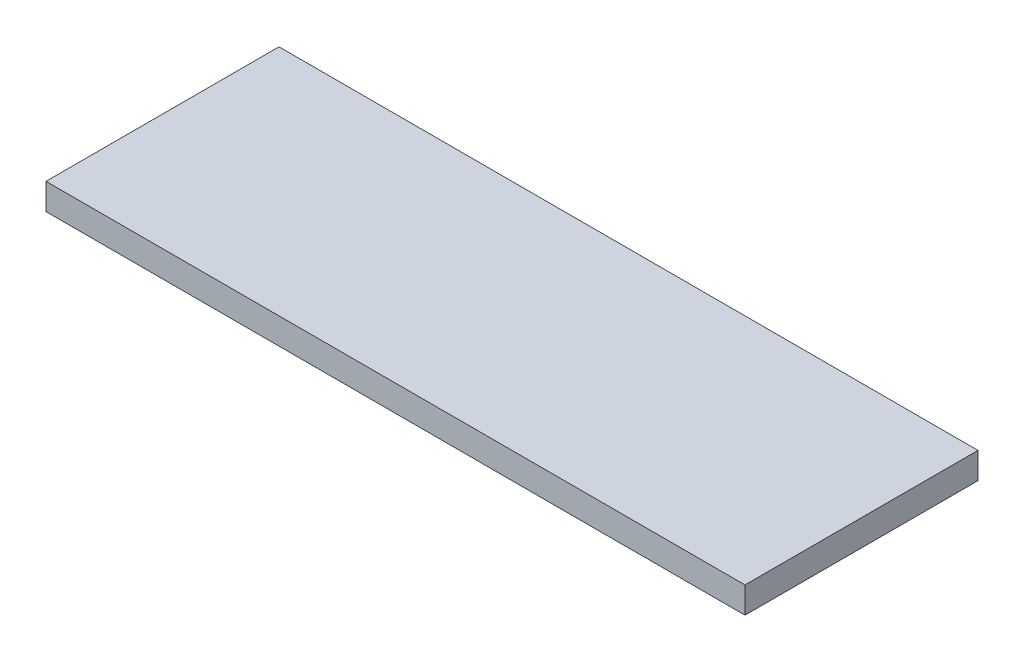
ISO-10303-21;
HEADER;
FILE_DESCRIPTION(('STEP AP214'),'2;1');
FILE_NAME('part.step','',(''),(''),'','','');
FILE_SCHEMA(('AUTOMOTIVE_DESIGN { 1 0 10303 214 1 1 1 1 }'));
ENDSEC;
DATA;
#1=APPLICATION_CONTEXT('core data for automotive mechanical design processes');
#2=APPLICATION_PROTOCOL_DEFINITION('international standard','automotive_design',2000,#1);
#3=PRODUCT_CONTEXT('',#1,'mechanical');
#4=PRODUCT('Part','Part','',(#3));
#5=PRODUCT_RELATED_PRODUCT_CATEGORY('part','',(#4));
#6=PRODUCT_DEFINITION_FORMATION('','',#4);
#7=PRODUCT_DEFINITION_CONTEXT('part definition',#1,'design');
#8=PRODUCT_DEFINITION('design','',#6,#7);
#9=PRODUCT_DEFINITION_SHAPE('','',#8);
#10=(LENGTH_UNIT() NAMED_UNIT(*) SI_UNIT(.MILLI.,.METRE.));
#11=(NAMED_UNIT(*) PLANE_ANGLE_UNIT() SI_UNIT($,.RADIAN.));
#12=(NAMED_UNIT(*) SI_UNIT($,.STERADIAN.) SOLID_ANGLE_UNIT());
#13=UNCERTAINTY_MEASURE_WITH_UNIT(LENGTH_MEASURE(1.E-05),#10,'distance_accuracy_value','');
#14=(GEOMETRIC_REPRESENTATION_CONTEXT(3) GLOBAL_UNCERTAINTY_ASSIGNED_CONTEXT((#13)) GLOBAL_UNIT_ASSIGNED_CONTEXT((#10,
#11,#12)) REPRESENTATION_CONTEXT('',''));
#15=CARTESIAN_POINT('',(0.,0.,0.));
#16=DIRECTION('',(0.,0.,1.));
#17=DIRECTION('',(1.,0.,0.));
#18=AXIS2_PLACEMENT_3D('',#15,#16,#17);
#19=CARTESIAN_POINT('',(0.,4.5,0.));
#20=DIRECTION('',(1.,0.,0.));
#21=DIRECTION('',(0.,0.,-1.));
#22=AXIS2_PLACEMENT_3D('',#19,#20,#21);
#23=PLANE('',#22);
#24=DIRECTION('',(0.,0.,1.));
#25=VECTOR('',#24,1.);
#26=CARTESIAN_POINT('',(0.,0.,0.));
#27=LINE('',#26,#25);
#28=CARTESIAN_POINT('',(0.,0.,-40.));
#29=VERTEX_POINT('',#28);
#30=CARTESIAN_POINT('',(0.,0.,0.));
#31=VERTEX_POINT('',#30);
#32=EDGE_CURVE('E98',#29,#31,#27,.T.);
#33=ORIENTED_EDGE('',*,*,#32,.T.);
#34=DIRECTION('',(0.,-1.,0.));
#35=VECTOR('',#34,1.);
#36=CARTESIAN_POINT('',(0.,4.5,0.));
#37=LINE('',#36,#35);
#38=CARTESIAN_POINT('',(0.,4.5,0.));
#39=VERTEX_POINT('',#38);
#40=EDGE_CURVE('E11',#39,#31,#37,.T.);
#41=ORIENTED_EDGE('',*,*,#40,.F.);
#42=DIRECTION('',(0.,0.,1.));
#43=VECTOR('',#42,1.);
#44=CARTESIAN_POINT('',(0.,4.5,0.));
#45=LINE('',#44,#43);
#46=CARTESIAN_POINT('',(0.,4.5,-40.));
#47=VERTEX_POINT('',#46);
#48=EDGE_CURVE('E86',#47,#39,#45,.T.);
#49=ORIENTED_EDGE('',*,*,#48,.F.);
#50=DIRECTION('',(0.,-1.,0.));
#51=VECTOR('',#50,1.);
#52=CARTESIAN_POINT('',(0.,4.5,-40.));
#53=LINE('',#52,#51);
#54=EDGE_CURVE('E94',#47,#29,#53,.T.);
#55=ORIENTED_EDGE('',*,*,#54,.T.);
#56=EDGE_LOOP('',(#33,#41,#49,#55));
#57=FACE_BOUND('',#56,.T.);
#58=ADVANCED_FACE('F35',(#57),#23,.F.);
#59=CARTESIAN_POINT('',(0.,4.5,0.));
#60=DIRECTION('',(0.,0.,-1.));
#61=DIRECTION('',(-1.,0.,0.));
#62=AXIS2_PLACEMENT_3D('',#59,#60,#61);
#63=PLANE('',#62);
#64=DIRECTION('',(1.,0.,0.));
#65=VECTOR('',#64,1.);
#66=CARTESIAN_POINT('',(0.,0.,0.));
#67=LINE('',#66,#65);
#68=CARTESIAN_POINT('',(120.,0.,0.));
#69=VERTEX_POINT('',#68);
#70=EDGE_CURVE('E90',#31,#69,#67,.T.);
#71=ORIENTED_EDGE('',*,*,#70,.T.);
#72=DIRECTION('',(0.,-1.,0.));
#73=VECTOR('',#72,1.);
#74=CARTESIAN_POINT('',(120.,4.5,0.));
#75=LINE('',#74,#73);
#76=CARTESIAN_POINT('',(120.,4.5,0.));
#77=VERTEX_POINT('',#76);
#78=EDGE_CURVE('E43',#77,#69,#75,.T.);
#79=ORIENTED_EDGE('',*,*,#78,.F.);
#80=DIRECTION('',(1.,0.,0.));
#81=VECTOR('',#80,1.);
#82=CARTESIAN_POINT('',(0.,4.5,0.));
#83=LINE('',#82,#81);
#84=EDGE_CURVE('E81',#39,#77,#83,.T.);
#85=ORIENTED_EDGE('',*,*,#84,.F.);
#86=ORIENTED_EDGE('',*,*,#40,.T.);
#87=EDGE_LOOP('',(#71,#79,#85,#86));
#88=FACE_BOUND('',#87,.T.);
#89=ADVANCED_FACE('F89',(#88),#63,.F.);
#90=CARTESIAN_POINT('',(120.,4.5,0.));
#91=DIRECTION('',(-1.,0.,0.));
#92=DIRECTION('',(0.,0.,1.));
#93=AXIS2_PLACEMENT_3D('',#90,#91,#92);
#94=PLANE('',#93);
#95=DIRECTION('',(0.,0.,-1.));
#96=VECTOR('',#95,1.);
#97=CARTESIAN_POINT('',(120.,0.,0.));
#98=LINE('',#97,#96);
#99=CARTESIAN_POINT('',(120.,0.,-40.));
#100=VERTEX_POINT('',#99);
#101=EDGE_CURVE('E68',#69,#100,#98,.T.);
#102=ORIENTED_EDGE('',*,*,#101,.T.);
#103=DIRECTION('',(0.,-1.,0.));
#104=VECTOR('',#103,1.);
#105=CARTESIAN_POINT('',(120.,4.5,-40.));
#106=LINE('',#105,#104);
#107=CARTESIAN_POINT('',(120.,4.5,-40.));
#108=VERTEX_POINT('',#107);
#109=EDGE_CURVE('E91',#108,#100,#106,.T.);
#110=ORIENTED_EDGE('',*,*,#109,.F.);
#111=DIRECTION('',(0.,0.,-1.));
#112=VECTOR('',#111,1.);
#113=CARTESIAN_POINT('',(120.,4.5,0.));
#114=LINE('',#113,#112);
#115=EDGE_CURVE('E84',#77,#108,#114,.T.);
#116=ORIENTED_EDGE('',*,*,#115,.F.);
#117=ORIENTED_EDGE('',*,*,#78,.T.);
#118=EDGE_LOOP('',(#102,#110,#116,#117));
#119=FACE_BOUND('',#118,.T.);
#120=ADVANCED_FACE('F92',(#119),#94,.F.);
#121=CARTESIAN_POINT('',(0.,4.5,-40.));
#122=DIRECTION('',(0.,0.,1.));
#123=DIRECTION('',(1.,0.,0.));
#124=AXIS2_PLACEMENT_3D('',#121,#122,#123);
#125=PLANE('',#124);
#126=DIRECTION('',(-1.,0.,0.));
#127=VECTOR('',#126,1.);
#128=CARTESIAN_POINT('',(0.,0.,-40.));
#129=LINE('',#128,#127);
#130=EDGE_CURVE('E74',#100,#29,#129,.T.);
#131=ORIENTED_EDGE('',*,*,#130,.T.);
#132=ORIENTED_EDGE('',*,*,#54,.F.);
#133=DIRECTION('',(-1.,0.,0.));
#134=VECTOR('',#133,1.);
#135=CARTESIAN_POINT('',(0.,4.5,-40.));
#136=LINE('',#135,#134);
#137=EDGE_CURVE('E51',#108,#47,#136,.T.);
#138=ORIENTED_EDGE('',*,*,#137,.F.);
#139=ORIENTED_EDGE('',*,*,#109,.T.);
#140=EDGE_LOOP('',(#131,#132,#138,#139));
#141=FACE_BOUND('',#140,.T.);
#142=ADVANCED_FACE('F105',(#141),#125,.F.);
#143=CARTESIAN_POINT('',(0.,4.5,0.));
#144=DIRECTION('',(0.,-1.,0.));
#145=DIRECTION('',(0.,0.,-1.));
#146=AXIS2_PLACEMENT_3D('',#143,#144,#145);
#147=PLANE('',#146);
#148=ORIENTED_EDGE('',*,*,#48,.T.);
#149=ORIENTED_EDGE('',*,*,#84,.T.);
#150=ORIENTED_EDGE('',*,*,#115,.T.);
#151=ORIENTED_EDGE('',*,*,#137,.T.);
#152=EDGE_LOOP('',(#148,#149,#150,#151));
#153=FACE_BOUND('',#152,.T.);
#154=ADVANCED_FACE('F82',(#153),#147,.F.);
#155=CARTESIAN_POINT('',(0.,0.,0.));
#156=DIRECTION('',(0.,-1.,0.));
#157=DIRECTION('',(0.,0.,-1.));
#158=AXIS2_PLACEMENT_3D('',#155,#156,#157);
#159=PLANE('',#158);
#160=ORIENTED_EDGE('',*,*,#32,.F.);
#161=ORIENTED_EDGE('',*,*,#130,.F.);
#162=ORIENTED_EDGE('',*,*,#101,.F.);
#163=ORIENTED_EDGE('',*,*,#70,.F.);
#164=EDGE_LOOP('',(#160,#161,#162,#163));
#165=FACE_BOUND('',#164,.T.);
#166=ADVANCED_FACE('F108',(#165),#159,.T.);
#167=CLOSED_SHELL('',(#58,#89,#120,#142,#154,#166));
#168=MANIFOLD_SOLID_BREP('B2',#167);
#169=ADVANCED_BREP_SHAPE_REPRESENTATION('',(#18,#168),#14);
#170=SHAPE_DEFINITION_REPRESENTATION(#9,#169);
ENDSEC;
END-ISO-10303-21;
